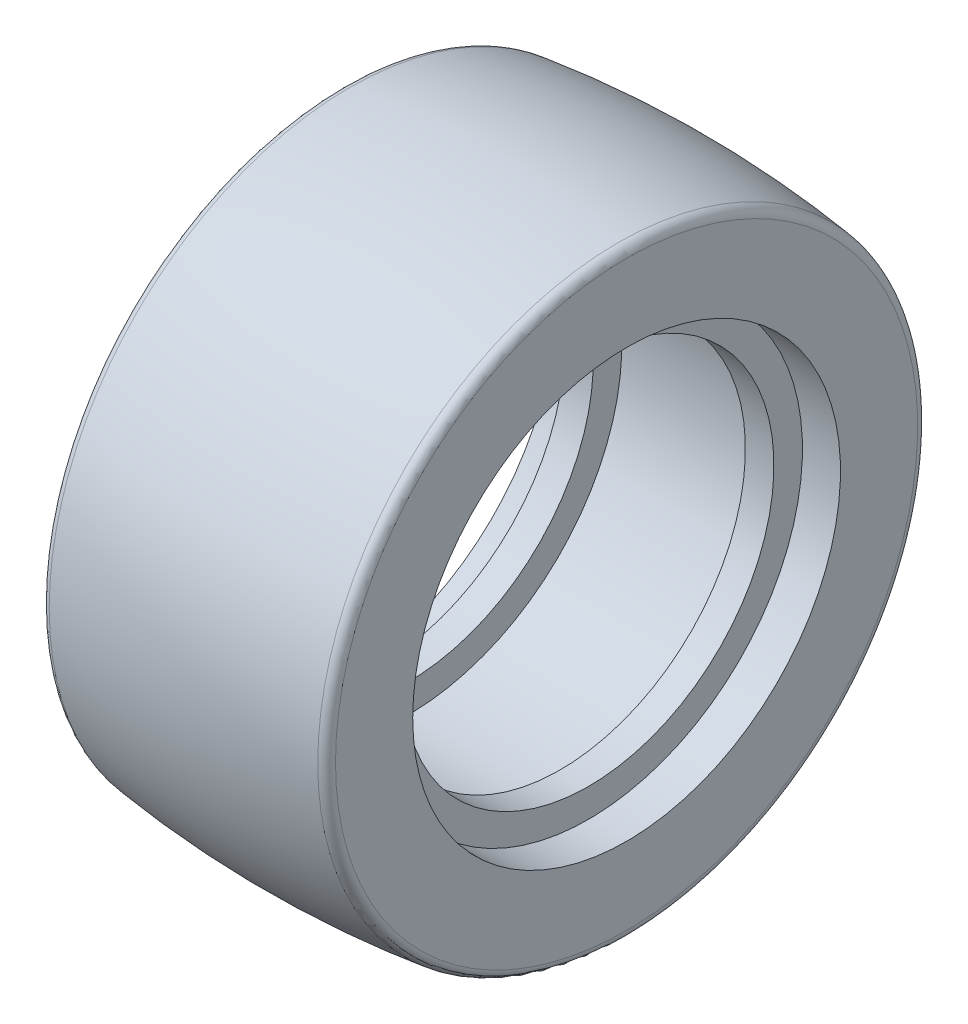
ISO-10303-21;
HEADER;
FILE_DESCRIPTION(('STEP AP214'),'2;1');
FILE_NAME('part.step','',(''),(''),'','','');
FILE_SCHEMA(('AUTOMOTIVE_DESIGN { 1 0 10303 214 1 1 1 1 }'));
ENDSEC;
DATA;
#1=APPLICATION_CONTEXT('core data for automotive mechanical design processes');
#2=APPLICATION_PROTOCOL_DEFINITION('international standard','automotive_design',2000,#1);
#3=PRODUCT_CONTEXT('',#1,'mechanical');
#4=PRODUCT('Part','Part','',(#3));
#5=PRODUCT_RELATED_PRODUCT_CATEGORY('part','',(#4));
#6=PRODUCT_DEFINITION_FORMATION('','',#4);
#7=PRODUCT_DEFINITION_CONTEXT('part definition',#1,'design');
#8=PRODUCT_DEFINITION('design','',#6,#7);
#9=PRODUCT_DEFINITION_SHAPE('','',#8);
#10=(LENGTH_UNIT() NAMED_UNIT(*) SI_UNIT(.MILLI.,.METRE.));
#11=(NAMED_UNIT(*) PLANE_ANGLE_UNIT() SI_UNIT($,.RADIAN.));
#12=(NAMED_UNIT(*) SI_UNIT($,.STERADIAN.) SOLID_ANGLE_UNIT());
#13=UNCERTAINTY_MEASURE_WITH_UNIT(LENGTH_MEASURE(1.E-05),#10,'distance_accuracy_value','');
#14=(GEOMETRIC_REPRESENTATION_CONTEXT(3) GLOBAL_UNCERTAINTY_ASSIGNED_CONTEXT((#13)) GLOBAL_UNIT_ASSIGNED_CONTEXT((#10,
#11,#12)) REPRESENTATION_CONTEXT('',''));
#15=CARTESIAN_POINT('',(0.,0.,0.));
#16=DIRECTION('',(0.,0.,1.));
#17=DIRECTION('',(1.,0.,0.));
#18=AXIS2_PLACEMENT_3D('',#15,#16,#17);
#19=CARTESIAN_POINT('',(0.,0.,0.));
#20=DIRECTION('',(-1.,0.,0.));
#21=DIRECTION('',(0.,0.,1.));
#22=AXIS2_PLACEMENT_3D('',#19,#20,#21);
#23=DEGENERATE_TOROIDAL_SURFACE('',#22,80.4999999999994,112.999999999999,.F.);
#24=CARTESIAN_POINT('',(14.125,0.,0.));
#25=DIRECTION('',(-1.,0.,0.));
#26=DIRECTION('',(0.,0.,1.));
#27=AXIS2_PLACEMENT_3D('',#24,#25,#26);
#28=CIRCLE('',#27,31.613711806362);
#29=CARTESIAN_POINT('',(14.125,0.,31.613711806362));
#30=VERTEX_POINT('',#29);
#31=EDGE_CURVE('E48',#30,#30,#28,.T.);
#32=ORIENTED_EDGE('',*,*,#31,.T.);
#33=EDGE_LOOP('',(#32));
#34=FACE_BOUND('',#33,.T.);
#35=CARTESIAN_POINT('',(-14.125,0.,0.));
#36=DIRECTION('',(1.,0.,0.));
#37=DIRECTION('',(0.,0.,-1.));
#38=AXIS2_PLACEMENT_3D('',#35,#36,#37);
#39=CIRCLE('',#38,31.613711806362);
#40=CARTESIAN_POINT('',(-14.125,0.,-31.613711806362));
#41=VERTEX_POINT('',#40);
#42=EDGE_CURVE('E52',#41,#41,#39,.T.);
#43=ORIENTED_EDGE('',*,*,#42,.T.);
#44=EDGE_LOOP('',(#43));
#45=FACE_BOUND('',#44,.T.);
#46=ADVANCED_FACE('F37',(#34,#45),#23,.F.);
#47=CARTESIAN_POINT('',(-15.,0.,0.));
#48=DIRECTION('',(-1.,0.,0.));
#49=DIRECTION('',(0.,0.,1.));
#50=AXIS2_PLACEMENT_3D('',#47,#48,#49);
#51=PLANE('',#50);
#52=CARTESIAN_POINT('',(-15.,0.,0.));
#53=DIRECTION('',(-1.,0.,0.));
#54=DIRECTION('',(0.,0.,1.));
#55=AXIS2_PLACEMENT_3D('',#52,#53,#54);
#56=CIRCLE('',#55,30.6215550647128);
#57=CARTESIAN_POINT('',(-15.,0.,30.6215550647128));
#58=VERTEX_POINT('',#57);
#59=EDGE_CURVE('E10',#58,#58,#56,.T.);
#60=ORIENTED_EDGE('',*,*,#59,.T.);
#61=EDGE_LOOP('',(#60));
#62=FACE_BOUND('',#61,.T.);
#63=CARTESIAN_POINT('',(-15.,0.,0.));
#64=DIRECTION('',(-1.,0.,0.));
#65=DIRECTION('',(0.,0.,1.));
#66=AXIS2_PLACEMENT_3D('',#63,#64,#65);
#67=CIRCLE('',#66,22.5);
#68=CARTESIAN_POINT('',(-15.,0.,22.5));
#69=VERTEX_POINT('',#68);
#70=EDGE_CURVE('E57',#69,#69,#67,.T.);
#71=ORIENTED_EDGE('',*,*,#70,.F.);
#72=EDGE_LOOP('',(#71));
#73=FACE_BOUND('',#72,.T.);
#74=ADVANCED_FACE('F141',(#62,#73),#51,.T.);
#75=CARTESIAN_POINT('',(-27.7290221349826,0.,0.));
#76=DIRECTION('',(-1.,0.,0.));
#77=DIRECTION('',(0.,0.,1.));
#78=AXIS2_PLACEMENT_3D('',#75,#76,#77);
#79=CYLINDRICAL_SURFACE('',#78,22.5);
#80=CARTESIAN_POINT('',(-11.,0.,0.));
#81=DIRECTION('',(-1.,0.,0.));
#82=DIRECTION('',(0.,0.,1.));
#83=AXIS2_PLACEMENT_3D('',#80,#81,#82);
#84=CIRCLE('',#83,22.5);
#85=CARTESIAN_POINT('',(-11.,0.,22.5));
#86=VERTEX_POINT('',#85);
#87=EDGE_CURVE('E60',#86,#86,#84,.T.);
#88=ORIENTED_EDGE('',*,*,#87,.F.);
#89=EDGE_LOOP('',(#88));
#90=FACE_BOUND('',#89,.T.);
#91=ORIENTED_EDGE('',*,*,#70,.T.);
#92=EDGE_LOOP('',(#91));
#93=FACE_BOUND('',#92,.T.);
#94=ADVANCED_FACE('F135',(#90,#93),#79,.F.);
#95=CARTESIAN_POINT('',(-11.,0.,0.));
#96=DIRECTION('',(1.,0.,0.));
#97=DIRECTION('',(0.,0.,-1.));
#98=AXIS2_PLACEMENT_3D('',#95,#96,#97);
#99=PLANE('',#98);
#100=CARTESIAN_POINT('',(-11.,0.,0.));
#101=DIRECTION('',(-1.,0.,0.));
#102=DIRECTION('',(0.,0.,1.));
#103=AXIS2_PLACEMENT_3D('',#100,#101,#102);
#104=CIRCLE('',#103,19.5);
#105=CARTESIAN_POINT('',(-11.,0.,19.5));
#106=VERTEX_POINT('',#105);
#107=EDGE_CURVE('E63',#106,#106,#104,.T.);
#108=ORIENTED_EDGE('',*,*,#107,.F.);
#109=EDGE_LOOP('',(#108));
#110=FACE_BOUND('',#109,.T.);
#111=ORIENTED_EDGE('',*,*,#87,.T.);
#112=EDGE_LOOP('',(#111));
#113=FACE_BOUND('',#112,.T.);
#114=ADVANCED_FACE('F129',(#110,#113),#99,.F.);
#115=CARTESIAN_POINT('',(-27.7290221349826,0.,0.));
#116=DIRECTION('',(-1.,0.,0.));
#117=DIRECTION('',(0.,0.,1.));
#118=AXIS2_PLACEMENT_3D('',#115,#116,#117);
#119=CYLINDRICAL_SURFACE('',#118,19.5);
#120=CARTESIAN_POINT('',(-8.,0.,0.));
#121=DIRECTION('',(-1.,0.,0.));
#122=DIRECTION('',(0.,0.,1.));
#123=AXIS2_PLACEMENT_3D('',#120,#121,#122);
#124=CIRCLE('',#123,19.5);
#125=CARTESIAN_POINT('',(-8.,0.,19.5));
#126=VERTEX_POINT('',#125);
#127=EDGE_CURVE('E66',#126,#126,#124,.T.);
#128=ORIENTED_EDGE('',*,*,#127,.F.);
#129=EDGE_LOOP('',(#128));
#130=FACE_BOUND('',#129,.T.);
#131=ORIENTED_EDGE('',*,*,#107,.T.);
#132=EDGE_LOOP('',(#131));
#133=FACE_BOUND('',#132,.T.);
#134=ADVANCED_FACE('F123',(#130,#133),#119,.F.);
#135=CARTESIAN_POINT('',(-8.,0.,0.));
#136=DIRECTION('',(-1.,0.,0.));
#137=DIRECTION('',(0.,0.,1.));
#138=AXIS2_PLACEMENT_3D('',#135,#136,#137);
#139=PLANE('',#138);
#140=CARTESIAN_POINT('',(-8.,0.,0.));
#141=DIRECTION('',(-1.,0.,0.));
#142=DIRECTION('',(0.,0.,1.));
#143=AXIS2_PLACEMENT_3D('',#140,#141,#142);
#144=CIRCLE('',#143,22.5);
#145=CARTESIAN_POINT('',(-8.,0.,22.5));
#146=VERTEX_POINT('',#145);
#147=EDGE_CURVE('E69',#146,#146,#144,.T.);
#148=ORIENTED_EDGE('',*,*,#147,.F.);
#149=EDGE_LOOP('',(#148));
#150=FACE_BOUND('',#149,.T.);
#151=ORIENTED_EDGE('',*,*,#127,.T.);
#152=EDGE_LOOP('',(#151));
#153=FACE_BOUND('',#152,.T.);
#154=ADVANCED_FACE('F117',(#150,#153),#139,.F.);
#155=CARTESIAN_POINT('',(-27.7290221349826,0.,0.));
#156=DIRECTION('',(-1.,0.,0.));
#157=DIRECTION('',(0.,0.,1.));
#158=AXIS2_PLACEMENT_3D('',#155,#156,#157);
#159=CYLINDRICAL_SURFACE('',#158,22.5);
#160=CARTESIAN_POINT('',(8.,0.,0.));
#161=DIRECTION('',(-1.,0.,0.));
#162=DIRECTION('',(0.,0.,1.));
#163=AXIS2_PLACEMENT_3D('',#160,#161,#162);
#164=CIRCLE('',#163,22.5);
#165=CARTESIAN_POINT('',(8.,0.,22.5));
#166=VERTEX_POINT('',#165);
#167=EDGE_CURVE('E72',#166,#166,#164,.T.);
#168=ORIENTED_EDGE('',*,*,#167,.F.);
#169=EDGE_LOOP('',(#168));
#170=FACE_BOUND('',#169,.T.);
#171=ORIENTED_EDGE('',*,*,#147,.T.);
#172=EDGE_LOOP('',(#171));
#173=FACE_BOUND('',#172,.T.);
#174=ADVANCED_FACE('F111',(#170,#173),#159,.F.);
#175=CARTESIAN_POINT('',(8.,0.,0.));
#176=DIRECTION('',(1.,0.,0.));
#177=DIRECTION('',(0.,0.,-1.));
#178=AXIS2_PLACEMENT_3D('',#175,#176,#177);
#179=PLANE('',#178);
#180=CARTESIAN_POINT('',(8.,0.,0.));
#181=DIRECTION('',(-1.,0.,0.));
#182=DIRECTION('',(0.,0.,1.));
#183=AXIS2_PLACEMENT_3D('',#180,#181,#182);
#184=CIRCLE('',#183,19.5);
#185=CARTESIAN_POINT('',(8.,0.,19.5));
#186=VERTEX_POINT('',#185);
#187=EDGE_CURVE('E75',#186,#186,#184,.T.);
#188=ORIENTED_EDGE('',*,*,#187,.F.);
#189=EDGE_LOOP('',(#188));
#190=FACE_BOUND('',#189,.T.);
#191=ORIENTED_EDGE('',*,*,#167,.T.);
#192=EDGE_LOOP('',(#191));
#193=FACE_BOUND('',#192,.T.);
#194=ADVANCED_FACE('F105',(#190,#193),#179,.F.);
#195=CARTESIAN_POINT('',(-27.7290221349826,0.,0.));
#196=DIRECTION('',(-1.,0.,0.));
#197=DIRECTION('',(0.,0.,1.));
#198=AXIS2_PLACEMENT_3D('',#195,#196,#197);
#199=CYLINDRICAL_SURFACE('',#198,19.5);
#200=CARTESIAN_POINT('',(11.,0.,0.));
#201=DIRECTION('',(-1.,0.,0.));
#202=DIRECTION('',(0.,0.,1.));
#203=AXIS2_PLACEMENT_3D('',#200,#201,#202);
#204=CIRCLE('',#203,19.5);
#205=CARTESIAN_POINT('',(11.,0.,19.5));
#206=VERTEX_POINT('',#205);
#207=EDGE_CURVE('E78',#206,#206,#204,.T.);
#208=ORIENTED_EDGE('',*,*,#207,.F.);
#209=EDGE_LOOP('',(#208));
#210=FACE_BOUND('',#209,.T.);
#211=ORIENTED_EDGE('',*,*,#187,.T.);
#212=EDGE_LOOP('',(#211));
#213=FACE_BOUND('',#212,.T.);
#214=ADVANCED_FACE('F99',(#210,#213),#199,.F.);
#215=CARTESIAN_POINT('',(11.,0.,0.));
#216=DIRECTION('',(-1.,0.,0.));
#217=DIRECTION('',(0.,0.,1.));
#218=AXIS2_PLACEMENT_3D('',#215,#216,#217);
#219=PLANE('',#218);
#220=CARTESIAN_POINT('',(11.,0.,0.));
#221=DIRECTION('',(-1.,0.,0.));
#222=DIRECTION('',(0.,0.,1.));
#223=AXIS2_PLACEMENT_3D('',#220,#221,#222);
#224=CIRCLE('',#223,22.5);
#225=CARTESIAN_POINT('',(11.,0.,22.5));
#226=VERTEX_POINT('',#225);
#227=EDGE_CURVE('E81',#226,#226,#224,.T.);
#228=ORIENTED_EDGE('',*,*,#227,.F.);
#229=EDGE_LOOP('',(#228));
#230=FACE_BOUND('',#229,.T.);
#231=ORIENTED_EDGE('',*,*,#207,.T.);
#232=EDGE_LOOP('',(#231));
#233=FACE_BOUND('',#232,.T.);
#234=ADVANCED_FACE('F93',(#230,#233),#219,.F.);
#235=CARTESIAN_POINT('',(-27.7290221349826,0.,0.));
#236=DIRECTION('',(-1.,0.,0.));
#237=DIRECTION('',(0.,0.,1.));
#238=AXIS2_PLACEMENT_3D('',#235,#236,#237);
#239=CYLINDRICAL_SURFACE('',#238,22.5);
#240=CARTESIAN_POINT('',(15.,0.,0.));
#241=DIRECTION('',(-1.,0.,0.));
#242=DIRECTION('',(0.,0.,1.));
#243=AXIS2_PLACEMENT_3D('',#240,#241,#242);
#244=CIRCLE('',#243,22.5);
#245=CARTESIAN_POINT('',(15.,0.,22.5));
#246=VERTEX_POINT('',#245);
#247=EDGE_CURVE('E84',#246,#246,#244,.T.);
#248=ORIENTED_EDGE('',*,*,#247,.F.);
#249=EDGE_LOOP('',(#248));
#250=FACE_BOUND('',#249,.T.);
#251=ORIENTED_EDGE('',*,*,#227,.T.);
#252=EDGE_LOOP('',(#251));
#253=FACE_BOUND('',#252,.T.);
#254=ADVANCED_FACE('F90',(#250,#253),#239,.F.);
#255=CARTESIAN_POINT('',(15.,0.,0.));
#256=DIRECTION('',(-1.,0.,0.));
#257=DIRECTION('',(0.,0.,1.));
#258=AXIS2_PLACEMENT_3D('',#255,#256,#257);
#259=PLANE('',#258);
#260=CARTESIAN_POINT('',(15.,0.,0.));
#261=DIRECTION('',(-1.,0.,0.));
#262=DIRECTION('',(0.,0.,1.));
#263=AXIS2_PLACEMENT_3D('',#260,#261,#262);
#264=CIRCLE('',#263,30.6215550647128);
#265=CARTESIAN_POINT('',(15.,0.,30.6215550647128));
#266=VERTEX_POINT('',#265);
#267=EDGE_CURVE('E44',#266,#266,#264,.F.);
#268=ORIENTED_EDGE('',*,*,#267,.T.);
#269=EDGE_LOOP('',(#268));
#270=FACE_BOUND('',#269,.T.);
#271=ORIENTED_EDGE('',*,*,#247,.T.);
#272=EDGE_LOOP('',(#271));
#273=FACE_BOUND('',#272,.T.);
#274=ADVANCED_FACE('F88',(#270,#273),#259,.F.);
#275=CARTESIAN_POINT('',(14.,0.,0.));
#276=DIRECTION('',(-1.,0.,0.));
#277=DIRECTION('',(0.,0.,1.));
#278=AXIS2_PLACEMENT_3D('',#275,#276,#277);
#279=TOROIDAL_SURFACE('',#278,30.6215550647128,1.);
#280=ORIENTED_EDGE('',*,*,#267,.F.);
#281=EDGE_LOOP('',(#280));
#282=FACE_BOUND('',#281,.T.);
#283=ORIENTED_EDGE('',*,*,#31,.F.);
#284=EDGE_LOOP('',(#283));
#285=FACE_BOUND('',#284,.T.);
#286=ADVANCED_FACE('F152',(#282,#285),#279,.T.);
#287=CARTESIAN_POINT('',(-14.,0.,0.));
#288=DIRECTION('',(-1.,0.,0.));
#289=DIRECTION('',(0.,0.,1.));
#290=AXIS2_PLACEMENT_3D('',#287,#288,#289);
#291=TOROIDAL_SURFACE('',#290,30.6215550647128,1.);
#292=ORIENTED_EDGE('',*,*,#42,.F.);
#293=EDGE_LOOP('',(#292));
#294=FACE_BOUND('',#293,.T.);
#295=ORIENTED_EDGE('',*,*,#59,.F.);
#296=EDGE_LOOP('',(#295));
#297=FACE_BOUND('',#296,.T.);
#298=ADVANCED_FACE('F39',(#294,#297),#291,.T.);
#299=CLOSED_SHELL('',(#46,#74,#94,#114,#134,#154,#174,#194,#214,#234,#254,#274,#286,#298));
#300=MANIFOLD_SOLID_BREP('B2',#299);
#301=ADVANCED_BREP_SHAPE_REPRESENTATION('',(#18,#300),#14);
#302=SHAPE_DEFINITION_REPRESENTATION(#9,#301);
ENDSEC;
END-ISO-10303-21;
